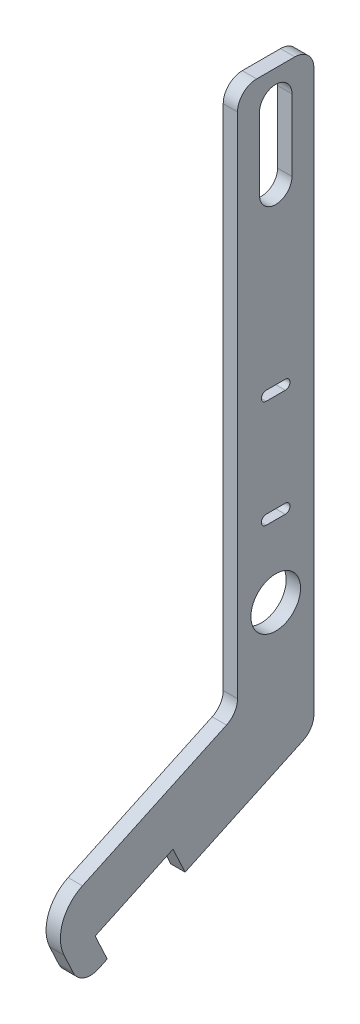
ISO-10303-21;
HEADER;
FILE_DESCRIPTION(('STEP AP214'),'2;1');
FILE_NAME('part.step','',(''),(''),'','','');
FILE_SCHEMA(('AUTOMOTIVE_DESIGN { 1 0 10303 214 1 1 1 1 }'));
ENDSEC;
DATA;
#1=APPLICATION_CONTEXT('core data for automotive mechanical design processes');
#2=APPLICATION_PROTOCOL_DEFINITION('international standard','automotive_design',2000,#1);
#3=PRODUCT_CONTEXT('',#1,'mechanical');
#4=PRODUCT('Part','Part','',(#3));
#5=PRODUCT_RELATED_PRODUCT_CATEGORY('part','',(#4));
#6=PRODUCT_DEFINITION_FORMATION('','',#4);
#7=PRODUCT_DEFINITION_CONTEXT('part definition',#1,'design');
#8=PRODUCT_DEFINITION('design','',#6,#7);
#9=PRODUCT_DEFINITION_SHAPE('','',#8);
#10=(LENGTH_UNIT() NAMED_UNIT(*) SI_UNIT(.MILLI.,.METRE.));
#11=(NAMED_UNIT(*) PLANE_ANGLE_UNIT() SI_UNIT($,.RADIAN.));
#12=(NAMED_UNIT(*) SI_UNIT($,.STERADIAN.) SOLID_ANGLE_UNIT());
#13=UNCERTAINTY_MEASURE_WITH_UNIT(LENGTH_MEASURE(1.E-05),#10,'distance_accuracy_value','');
#14=(GEOMETRIC_REPRESENTATION_CONTEXT(3) GLOBAL_UNCERTAINTY_ASSIGNED_CONTEXT((#13)) GLOBAL_UNIT_ASSIGNED_CONTEXT((#10,
#11,#12)) REPRESENTATION_CONTEXT('',''));
#15=CARTESIAN_POINT('',(0.,0.,0.));
#16=DIRECTION('',(0.,0.,1.));
#17=DIRECTION('',(1.,0.,0.));
#18=AXIS2_PLACEMENT_3D('',#15,#16,#17);
#19=CARTESIAN_POINT('',(0.,0.,0.));
#20=DIRECTION('',(1.,0.,0.));
#21=DIRECTION('',(0.,0.,-1.));
#22=AXIS2_PLACEMENT_3D('',#19,#20,#21);
#23=PLANE('',#22);
#24=CARTESIAN_POINT('',(0.,45.0488935718911,-29.8263171494505));
#25=DIRECTION('',(1.,0.,0.));
#26=DIRECTION('',(0.,0.,-1.));
#27=AXIS2_PLACEMENT_3D('',#24,#25,#26);
#28=CIRCLE('',#27,0.5);
#29=CARTESIAN_POINT('',(0.,45.5488935718911,-29.8263171494505));
#30=VERTEX_POINT('',#29);
#31=CARTESIAN_POINT('',(0.,44.5488935718911,-29.8263171494505));
#32=VERTEX_POINT('',#31);
#33=EDGE_CURVE('E62',#30,#32,#28,.T.);
#34=ORIENTED_EDGE('',*,*,#33,.F.);
#35=DIRECTION('',(0.,0.,1.));
#36=VECTOR('',#35,1.);
#37=CARTESIAN_POINT('',(0.,45.5488935718911,-29.8263171494505));
#38=LINE('',#37,#36);
#39=CARTESIAN_POINT('',(0.,45.5488935718911,-31.8263171494505));
#40=VERTEX_POINT('',#39);
#41=EDGE_CURVE('E252',#40,#30,#38,.T.);
#42=ORIENTED_EDGE('',*,*,#41,.F.);
#43=CARTESIAN_POINT('',(0.,45.0488935718911,-31.8263171494505));
#44=DIRECTION('',(1.,0.,0.));
#45=DIRECTION('',(0.,0.,-1.));
#46=AXIS2_PLACEMENT_3D('',#43,#44,#45);
#47=CIRCLE('',#46,0.5);
#48=CARTESIAN_POINT('',(0.,44.5488935718911,-31.8263171494505));
#49=VERTEX_POINT('',#48);
#50=EDGE_CURVE('E255',#49,#40,#47,.T.);
#51=ORIENTED_EDGE('',*,*,#50,.F.);
#52=DIRECTION('',(0.,0.,-1.));
#53=VECTOR('',#52,1.);
#54=CARTESIAN_POINT('',(0.,44.5488935718911,-29.8263171494505));
#55=LINE('',#54,#53);
#56=EDGE_CURVE('E261',#32,#49,#55,.T.);
#57=ORIENTED_EDGE('',*,*,#56,.F.);
#58=EDGE_LOOP('',(#34,#42,#51,#57));
#59=FACE_BOUND('',#58,.T.);
#60=CARTESIAN_POINT('',(0.,33.8,-29.8263171494505));
#61=DIRECTION('',(1.,0.,0.));
#62=DIRECTION('',(0.,0.,-1.));
#63=AXIS2_PLACEMENT_3D('',#60,#61,#62);
#64=CIRCLE('',#63,0.5);
#65=CARTESIAN_POINT('',(0.,34.3,-29.8263171494505));
#66=VERTEX_POINT('',#65);
#67=CARTESIAN_POINT('',(0.,33.3,-29.8263171494505));
#68=VERTEX_POINT('',#67);
#69=EDGE_CURVE('E70',#66,#68,#64,.T.);
#70=ORIENTED_EDGE('',*,*,#69,.F.);
#71=DIRECTION('',(0.,0.,1.));
#72=VECTOR('',#71,1.);
#73=CARTESIAN_POINT('',(0.,34.3,-29.8263171494505));
#74=LINE('',#73,#72);
#75=CARTESIAN_POINT('',(0.,34.3,-31.8263171494505));
#76=VERTEX_POINT('',#75);
#77=EDGE_CURVE('E276',#76,#66,#74,.T.);
#78=ORIENTED_EDGE('',*,*,#77,.F.);
#79=CARTESIAN_POINT('',(0.,33.8,-31.8263171494505));
#80=DIRECTION('',(1.,0.,0.));
#81=DIRECTION('',(0.,0.,-1.));
#82=AXIS2_PLACEMENT_3D('',#79,#80,#81);
#83=CIRCLE('',#82,0.5);
#84=CARTESIAN_POINT('',(0.,33.3,-31.8263171494505));
#85=VERTEX_POINT('',#84);
#86=EDGE_CURVE('E290',#85,#76,#83,.T.);
#87=ORIENTED_EDGE('',*,*,#86,.F.);
#88=DIRECTION('',(0.,0.,-1.));
#89=VECTOR('',#88,1.);
#90=CARTESIAN_POINT('',(0.,33.3,-29.8263171494505));
#91=LINE('',#90,#89);
#92=EDGE_CURVE('E287',#68,#85,#91,.T.);
#93=ORIENTED_EDGE('',*,*,#92,.F.);
#94=EDGE_LOOP('',(#70,#78,#87,#93));
#95=FACE_BOUND('',#94,.T.);
#96=DIRECTION('',(0.,1.,0.));
#97=VECTOR('',#96,1.);
#98=CARTESIAN_POINT('',(0.,21.8,-34.8263171494505));
#99=LINE('',#98,#97);
#100=CARTESIAN_POINT('',(0.,13.636226777601,-34.8263171494505));
#101=VERTEX_POINT('',#100);
#102=CARTESIAN_POINT('',(0.,72.2977871437821,-34.8263171494505));
#103=VERTEX_POINT('',#102);
#104=EDGE_CURVE('E363',#101,#103,#99,.T.);
#105=ORIENTED_EDGE('',*,*,#104,.T.);
#106=CARTESIAN_POINT('',(0.,72.2977871437821,-32.8263171494505));
#107=DIRECTION('',(1.,0.,0.));
#108=DIRECTION('',(0.,0.,-1.));
#109=AXIS2_PLACEMENT_3D('',#106,#107,#108);
#110=CIRCLE('',#109,2.);
#111=CARTESIAN_POINT('',(0.,74.2977871437821,-32.8263171494505));
#112=VERTEX_POINT('',#111);
#113=EDGE_CURVE('E311',#103,#112,#110,.T.);
#114=ORIENTED_EDGE('',*,*,#113,.T.);
#115=DIRECTION('',(0.,0.,1.));
#116=VECTOR('',#115,1.);
#117=CARTESIAN_POINT('',(0.,74.2977871437821,-34.8263171494505));
#118=LINE('',#117,#116);
#119=CARTESIAN_POINT('',(0.,74.2977871437821,-28.8263171494505));
#120=VERTEX_POINT('',#119);
#121=EDGE_CURVE('E308',#112,#120,#118,.T.);
#122=ORIENTED_EDGE('',*,*,#121,.T.);
#123=CARTESIAN_POINT('',(0.,72.2977871437821,-28.8263171494505));
#124=DIRECTION('',(1.,0.,0.));
#125=DIRECTION('',(0.,0.,-1.));
#126=AXIS2_PLACEMENT_3D('',#123,#124,#125);
#127=CIRCLE('',#126,2.);
#128=CARTESIAN_POINT('',(0.,72.2977871437821,-26.8263171494505));
#129=VERTEX_POINT('',#128);
#130=EDGE_CURVE('E305',#120,#129,#127,.T.);
#131=ORIENTED_EDGE('',*,*,#130,.T.);
#132=DIRECTION('',(0.,-1.,0.));
#133=VECTOR('',#132,1.);
#134=CARTESIAN_POINT('',(0.,63.8,-26.8263171494505));
#135=LINE('',#134,#133);
#136=CARTESIAN_POINT('',(0.,19.0638022397498,-26.8263171494505));
#137=VERTEX_POINT('',#136);
#138=EDGE_CURVE('E449',#129,#137,#135,.T.);
#139=ORIENTED_EDGE('',*,*,#138,.T.);
#140=CARTESIAN_POINT('',(0.,19.0638022397497,-24.8263171494505));
#141=DIRECTION('',(1.,0.,0.));
#142=DIRECTION('',(0.,0.,-1.));
#143=AXIS2_PLACEMENT_3D('',#140,#141,#142);
#144=CIRCLE('',#143,2.);
#145=CARTESIAN_POINT('',(0.,17.2511866656764,-25.6715536729319));
#146=VERTEX_POINT('',#145);
#147=EDGE_CURVE('E379',#137,#146,#144,.F.);
#148=ORIENTED_EDGE('',*,*,#147,.T.);
#149=DIRECTION('',(0.,-0.422618261740694,0.906307787036653));
#150=VECTOR('',#149,1.);
#151=CARTESIAN_POINT('',(0.,8.52235463240421,-6.95251296961377));
#152=LINE('',#151,#150);
#153=CARTESIAN_POINT('',(0.,10.212827679367,-10.5777441177604));
#154=VERTEX_POINT('',#153);
#155=EDGE_CURVE('E376',#146,#154,#152,.T.);
#156=ORIENTED_EDGE('',*,*,#155,.T.);
#157=CARTESIAN_POINT('',(0.,6.58759653122038,-12.2682171647232));
#158=DIRECTION('',(1.,0.,0.));
#159=DIRECTION('',(0.,0.,-1.));
#160=AXIS2_PLACEMENT_3D('',#157,#158,#159);
#161=CIRCLE('',#160,4.);
#162=CARTESIAN_POINT('',(0.,4.8971234842576,-8.64298601657654));
#163=VERTEX_POINT('',#162);
#164=EDGE_CURVE('E374',#154,#163,#161,.T.);
#165=ORIENTED_EDGE('',*,*,#164,.T.);
#166=DIRECTION('',(0.,-0.906307787036653,-0.422618261740694));
#167=VECTOR('',#166,1.);
#168=CARTESIAN_POINT('',(0.,2.35946168055498,-9.82631714945048));
#169=LINE('',#168,#167);
#170=CARTESIAN_POINT('',(0.,2.81261557407331,-9.61500801858014));
#171=VERTEX_POINT('',#170);
#172=EDGE_CURVE('E372',#163,#171,#169,.T.);
#173=ORIENTED_EDGE('',*,*,#172,.T.);
#174=CARTESIAN_POINT('',(0.,3.65785209755469,-11.4276235926534));
#175=DIRECTION('',(1.,0.,0.));
#176=DIRECTION('',(0.,0.,-1.));
#177=AXIS2_PLACEMENT_3D('',#174,#175,#176);
#178=CIRCLE('',#177,2.);
#179=CARTESIAN_POINT('',(0.,1.84523652348139,-12.2728601161348));
#180=VERTEX_POINT('',#179);
#181=EDGE_CURVE('E370',#171,#180,#178,.T.);
#182=ORIENTED_EDGE('',*,*,#181,.T.);
#183=DIRECTION('',(0.,0.422618261740694,-0.906307787036652));
#184=VECTOR('',#183,1.);
#185=CARTESIAN_POINT('',(0.,1.,-10.4602445420615));
#186=LINE('',#185,#184);
#187=CARTESIAN_POINT('',(0.,2.26785478522208,-13.1791679031715));
#188=VERTEX_POINT('',#187);
#189=EDGE_CURVE('E368',#180,#188,#186,.T.);
#190=ORIENTED_EDGE('',*,*,#189,.T.);
#191=DIRECTION('',(0.,-0.906307787036652,-0.422618261740694));
#192=VECTOR('',#191,1.);
#193=CARTESIAN_POINT('',(0.,4.98677814633204,-11.9113131179494));
#194=LINE('',#193,#192);
#195=CARTESIAN_POINT('',(0.,4.98677814633204,-11.9113131179494));
#196=VERTEX_POINT('',#195);
#197=EDGE_CURVE('E424',#196,#188,#194,.T.);
#198=ORIENTED_EDGE('',*,*,#197,.F.);
#199=DIRECTION('',(0.,-0.422618261740694,0.906307787036652));
#200=VECTOR('',#199,1.);
#201=CARTESIAN_POINT('',(0.,8.79034250199829,-20.0680832012793));
#202=LINE('',#201,#200);
#203=CARTESIAN_POINT('',(0.,8.79034250199829,-20.0680832012793));
#204=VERTEX_POINT('',#203);
#205=EDGE_CURVE('E419',#204,#196,#202,.T.);
#206=ORIENTED_EDGE('',*,*,#205,.F.);
#207=DIRECTION('',(0.,0.906307787036652,0.422618261740694));
#208=VECTOR('',#207,1.);
#209=CARTESIAN_POINT('',(0.,6.07141914088833,-21.3359379865014));
#210=LINE('',#209,#208);
#211=CARTESIAN_POINT('',(0.,6.07141914088833,-21.3359379865014));
#212=VERTEX_POINT('',#211);
#213=EDGE_CURVE('E414',#212,#204,#210,.T.);
#214=ORIENTED_EDGE('',*,*,#213,.F.);
#215=CARTESIAN_POINT('',(0.,11.8236112035277,-33.6715536729319));
#216=VERTEX_POINT('',#215);
#217=EDGE_CURVE('E367',#212,#216,#186,.T.);
#218=ORIENTED_EDGE('',*,*,#217,.T.);
#219=CARTESIAN_POINT('',(0.,13.636226777601,-32.8263171494505));
#220=DIRECTION('',(1.,0.,0.));
#221=DIRECTION('',(0.,0.,-1.));
#222=AXIS2_PLACEMENT_3D('',#219,#220,#221);
#223=CIRCLE('',#222,2.);
#224=EDGE_CURVE('E364',#216,#101,#223,.T.);
#225=ORIENTED_EDGE('',*,*,#224,.T.);
#226=EDGE_LOOP('',(#105,#114,#122,#131,#139,#148,#156,#165,#173,#182,#190,#198,#206,#214,#218,#225));
#227=FACE_BOUND('',#226,.T.);
#228=CARTESIAN_POINT('',(0.,25.8,-30.8263171494505));
#229=DIRECTION('',(1.,0.,0.));
#230=DIRECTION('',(0.,0.,-1.));
#231=AXIS2_PLACEMENT_3D('',#228,#229,#230);
#232=CIRCLE('',#231,2.6);
#233=CARTESIAN_POINT('',(0.,25.8,-33.4263171494505));
#234=VERTEX_POINT('',#233);
#235=EDGE_CURVE('E304',#234,#234,#232,.T.);
#236=ORIENTED_EDGE('',*,*,#235,.F.);
#237=EDGE_LOOP('',(#236));
#238=FACE_BOUND('',#237,.T.);
#239=CARTESIAN_POINT('',(0.,71.0977871437821,-30.8263171494505));
#240=DIRECTION('',(1.,0.,0.));
#241=DIRECTION('',(0.,0.,-1.));
#242=AXIS2_PLACEMENT_3D('',#239,#240,#241);
#243=CIRCLE('',#242,1.7);
#244=CARTESIAN_POINT('',(0.,71.0977871437821,-32.5263171494505));
#245=VERTEX_POINT('',#244);
#246=CARTESIAN_POINT('',(0.,71.0977871437821,-29.1263171494505));
#247=VERTEX_POINT('',#246);
#248=EDGE_CURVE('E340',#245,#247,#243,.T.);
#249=ORIENTED_EDGE('',*,*,#248,.F.);
#250=DIRECTION('',(0.,1.,0.));
#251=VECTOR('',#250,1.);
#252=CARTESIAN_POINT('',(0.,71.0977871437821,-32.5263171494505));
#253=LINE('',#252,#251);
#254=CARTESIAN_POINT('',(0.,63.5977871437821,-32.5263171494505));
#255=VERTEX_POINT('',#254);
#256=EDGE_CURVE('E335',#255,#245,#253,.T.);
#257=ORIENTED_EDGE('',*,*,#256,.F.);
#258=CARTESIAN_POINT('',(0.,63.5977871437821,-30.8263171494505));
#259=DIRECTION('',(1.,0.,0.));
#260=DIRECTION('',(0.,0.,-1.));
#261=AXIS2_PLACEMENT_3D('',#258,#259,#260);
#262=CIRCLE('',#261,1.7);
#263=CARTESIAN_POINT('',(0.,63.5977871437821,-29.1263171494505));
#264=VERTEX_POINT('',#263);
#265=EDGE_CURVE('E350',#264,#255,#262,.T.);
#266=ORIENTED_EDGE('',*,*,#265,.F.);
#267=DIRECTION('',(0.,-1.,0.));
#268=VECTOR('',#267,1.);
#269=CARTESIAN_POINT('',(0.,71.0977871437821,-29.1263171494505));
#270=LINE('',#269,#268);
#271=EDGE_CURVE('E345',#247,#264,#270,.T.);
#272=ORIENTED_EDGE('',*,*,#271,.F.);
#273=EDGE_LOOP('',(#249,#257,#266,#272));
#274=FACE_BOUND('',#273,.T.);
#275=ADVANCED_FACE('F47',(#59,#95,#227,#238,#274),#23,.T.);
#276=CARTESIAN_POINT('',(-1.5,21.8,-34.8263171494505));
#277=DIRECTION('',(0.,0.,-1.));
#278=DIRECTION('',(0.,1.,0.));
#279=AXIS2_PLACEMENT_3D('',#276,#277,#278);
#280=PLANE('',#279);
#281=DIRECTION('',(0.,1.,0.));
#282=VECTOR('',#281,1.);
#283=CARTESIAN_POINT('',(-1.5,12.362086255986,-34.8263171494505));
#284=LINE('',#283,#282);
#285=CARTESIAN_POINT('',(-1.5,13.636226777601,-34.8263171494505));
#286=VERTEX_POINT('',#285);
#287=CARTESIAN_POINT('',(-1.50000000000001,72.2977871437821,-34.8263171494504));
#288=VERTEX_POINT('',#287);
#289=EDGE_CURVE('E50',#286,#288,#284,.T.);
#290=ORIENTED_EDGE('',*,*,#289,.T.);
#291=DIRECTION('',(1.,0.,0.));
#292=VECTOR('',#291,1.);
#293=CARTESIAN_POINT('',(-1.50000000000001,72.2977871437821,-34.8263171494505));
#294=LINE('',#293,#292);
#295=EDGE_CURVE('E301',#288,#103,#294,.T.);
#296=ORIENTED_EDGE('',*,*,#295,.T.);
#297=ORIENTED_EDGE('',*,*,#104,.F.);
#298=DIRECTION('',(1.,0.,0.));
#299=VECTOR('',#298,1.);
#300=CARTESIAN_POINT('',(-1.5,13.636226777601,-34.8263171494505));
#301=LINE('',#300,#299);
#302=EDGE_CURVE('E381',#101,#286,#301,.F.);
#303=ORIENTED_EDGE('',*,*,#302,.T.);
#304=EDGE_LOOP('',(#290,#296,#297,#303));
#305=FACE_BOUND('',#304,.T.);
#306=ADVANCED_FACE('F462',(#305),#280,.T.);
#307=CARTESIAN_POINT('',(-1.5,63.8,-26.8263171494505));
#308=DIRECTION('',(0.,0.,1.));
#309=DIRECTION('',(0.,-1.,0.));
#310=AXIS2_PLACEMENT_3D('',#307,#308,#309);
#311=PLANE('',#310);
#312=ORIENTED_EDGE('',*,*,#138,.F.);
#313=DIRECTION('',(1.,0.,0.));
#314=VECTOR('',#313,1.);
#315=CARTESIAN_POINT('',(-1.50000000000001,72.2977871437821,-26.8263171494505));
#316=LINE('',#315,#314);
#317=CARTESIAN_POINT('',(-1.50000000000001,72.2977871437821,-26.8263171494505));
#318=VERTEX_POINT('',#317);
#319=EDGE_CURVE('E313',#129,#318,#316,.F.);
#320=ORIENTED_EDGE('',*,*,#319,.T.);
#321=DIRECTION('',(0.,-1.,0.));
#322=VECTOR('',#321,1.);
#323=CARTESIAN_POINT('',(-1.5,63.8,-26.8263171494505));
#324=LINE('',#323,#322);
#325=CARTESIAN_POINT('',(-1.5,19.0638022397498,-26.8263171494505));
#326=VERTEX_POINT('',#325);
#327=EDGE_CURVE('E12',#318,#326,#324,.T.);
#328=ORIENTED_EDGE('',*,*,#327,.T.);
#329=DIRECTION('',(1.,0.,0.));
#330=VECTOR('',#329,1.);
#331=CARTESIAN_POINT('',(0.,19.0638022397497,-26.8263171494505));
#332=LINE('',#331,#330);
#333=EDGE_CURVE('E360',#326,#137,#332,.T.);
#334=ORIENTED_EDGE('',*,*,#333,.T.);
#335=EDGE_LOOP('',(#312,#320,#328,#334));
#336=FACE_BOUND('',#335,.T.);
#337=ADVANCED_FACE('F482',(#336),#311,.T.);
#338=CARTESIAN_POINT('',(-1.5,0.,0.));
#339=DIRECTION('',(1.,0.,0.));
#340=DIRECTION('',(0.,0.,-1.));
#341=AXIS2_PLACEMENT_3D('',#338,#339,#340);
#342=PLANE('',#341);
#343=DIRECTION('',(0.,0.,1.));
#344=VECTOR('',#343,1.);
#345=CARTESIAN_POINT('',(-1.50000000000001,45.5488935718911,-29.8263171494505));
#346=LINE('',#345,#344);
#347=CARTESIAN_POINT('',(-1.50000000000001,45.5488935718911,-31.8263171494505));
#348=VERTEX_POINT('',#347);
#349=CARTESIAN_POINT('',(-1.50000000000001,45.5488935718911,-29.8263171494505));
#350=VERTEX_POINT('',#349);
#351=EDGE_CURVE('E239',#348,#350,#346,.T.);
#352=ORIENTED_EDGE('',*,*,#351,.T.);
#353=CARTESIAN_POINT('',(-1.50000000000001,45.0488935718911,-29.8263171494505));
#354=DIRECTION('',(1.,0.,0.));
#355=DIRECTION('',(0.,0.,-1.));
#356=AXIS2_PLACEMENT_3D('',#353,#354,#355);
#357=CIRCLE('',#356,0.5);
#358=CARTESIAN_POINT('',(-1.50000000000001,44.5488935718911,-29.8263171494505));
#359=VERTEX_POINT('',#358);
#360=EDGE_CURVE('E233',#350,#359,#357,.T.);
#361=ORIENTED_EDGE('',*,*,#360,.T.);
#362=DIRECTION('',(0.,0.,-1.));
#363=VECTOR('',#362,1.);
#364=CARTESIAN_POINT('',(-1.50000000000001,44.5488935718911,-29.8263171494505));
#365=LINE('',#364,#363);
#366=CARTESIAN_POINT('',(-1.5,44.5488935718911,-31.8263171494505));
#367=VERTEX_POINT('',#366);
#368=EDGE_CURVE('E243',#359,#367,#365,.T.);
#369=ORIENTED_EDGE('',*,*,#368,.T.);
#370=CARTESIAN_POINT('',(-1.50000000000001,45.0488935718911,-31.8263171494505));
#371=DIRECTION('',(1.,0.,0.));
#372=DIRECTION('',(0.,0.,-1.));
#373=AXIS2_PLACEMENT_3D('',#370,#371,#372);
#374=CIRCLE('',#373,0.5);
#375=EDGE_CURVE('E247',#367,#348,#374,.T.);
#376=ORIENTED_EDGE('',*,*,#375,.T.);
#377=EDGE_LOOP('',(#352,#361,#369,#376));
#378=FACE_BOUND('',#377,.T.);
#379=DIRECTION('',(0.,0.,1.));
#380=VECTOR('',#379,1.);
#381=CARTESIAN_POINT('',(-1.50000000000001,34.3,-29.8263171494505));
#382=LINE('',#381,#380);
#383=CARTESIAN_POINT('',(-1.50000000000001,34.3,-31.8263171494505));
#384=VERTEX_POINT('',#383);
#385=CARTESIAN_POINT('',(-1.50000000000001,34.3,-29.8263171494505));
#386=VERTEX_POINT('',#385);
#387=EDGE_CURVE('E282',#384,#386,#382,.T.);
#388=ORIENTED_EDGE('',*,*,#387,.T.);
#389=CARTESIAN_POINT('',(-1.50000000000001,33.8,-29.8263171494505));
#390=DIRECTION('',(1.,0.,0.));
#391=DIRECTION('',(0.,0.,-1.));
#392=AXIS2_PLACEMENT_3D('',#389,#390,#391);
#393=CIRCLE('',#392,0.5);
#394=CARTESIAN_POINT('',(-1.50000000000001,33.3,-29.8263171494505));
#395=VERTEX_POINT('',#394);
#396=EDGE_CURVE('E272',#386,#395,#393,.T.);
#397=ORIENTED_EDGE('',*,*,#396,.T.);
#398=DIRECTION('',(0.,0.,-1.));
#399=VECTOR('',#398,1.);
#400=CARTESIAN_POINT('',(-1.50000000000001,33.3,-29.8263171494505));
#401=LINE('',#400,#399);
#402=CARTESIAN_POINT('',(-1.5,33.3,-31.8263171494505));
#403=VERTEX_POINT('',#402);
#404=EDGE_CURVE('E275',#395,#403,#401,.T.);
#405=ORIENTED_EDGE('',*,*,#404,.T.);
#406=CARTESIAN_POINT('',(-1.50000000000001,33.8,-31.8263171494505));
#407=DIRECTION('',(1.,0.,0.));
#408=DIRECTION('',(0.,0.,-1.));
#409=AXIS2_PLACEMENT_3D('',#406,#407,#408);
#410=CIRCLE('',#409,0.5);
#411=EDGE_CURVE('E279',#403,#384,#410,.T.);
#412=ORIENTED_EDGE('',*,*,#411,.T.);
#413=EDGE_LOOP('',(#388,#397,#405,#412));
#414=FACE_BOUND('',#413,.T.);
#415=ORIENTED_EDGE('',*,*,#327,.F.);
#416=CARTESIAN_POINT('',(-1.50000000000001,72.2977871437821,-28.8263171494505));
#417=DIRECTION('',(1.,0.,0.));
#418=DIRECTION('',(0.,0.,-1.));
#419=AXIS2_PLACEMENT_3D('',#416,#417,#418);
#420=CIRCLE('',#419,2.);
#421=CARTESIAN_POINT('',(-1.50000000000001,74.2977871437821,-28.8263171494505));
#422=VERTEX_POINT('',#421);
#423=EDGE_CURVE('E319',#318,#422,#420,.F.);
#424=ORIENTED_EDGE('',*,*,#423,.T.);
#425=DIRECTION('',(0.,0.,1.));
#426=VECTOR('',#425,1.);
#427=CARTESIAN_POINT('',(-1.50000000000001,74.2977871437821,-34.8263171494505));
#428=LINE('',#427,#426);
#429=CARTESIAN_POINT('',(-1.50000000000001,74.2977871437821,-32.8263171494505));
#430=VERTEX_POINT('',#429);
#431=EDGE_CURVE('E356',#430,#422,#428,.T.);
#432=ORIENTED_EDGE('',*,*,#431,.F.);
#433=CARTESIAN_POINT('',(-1.50000000000001,72.2977871437821,-32.8263171494505));
#434=DIRECTION('',(1.,0.,0.));
#435=DIRECTION('',(0.,0.,-1.));
#436=AXIS2_PLACEMENT_3D('',#433,#434,#435);
#437=CIRCLE('',#436,2.);
#438=EDGE_CURVE('E316',#430,#288,#437,.F.);
#439=ORIENTED_EDGE('',*,*,#438,.T.);
#440=ORIENTED_EDGE('',*,*,#289,.F.);
#441=CARTESIAN_POINT('',(-1.5,13.636226777601,-32.8263171494505));
#442=DIRECTION('',(1.,0.,0.));
#443=DIRECTION('',(0.,0.,-1.));
#444=AXIS2_PLACEMENT_3D('',#441,#442,#443);
#445=CIRCLE('',#444,2.);
#446=CARTESIAN_POINT('',(-1.5,11.8236112035277,-33.6715536729319));
#447=VERTEX_POINT('',#446);
#448=EDGE_CURVE('E404',#286,#447,#445,.F.);
#449=ORIENTED_EDGE('',*,*,#448,.T.);
#450=DIRECTION('',(0.,0.422618261740694,-0.906307787036652));
#451=VECTOR('',#450,1.);
#452=CARTESIAN_POINT('',(-1.5,1.,-10.4602445420615));
#453=LINE('',#452,#451);
#454=CARTESIAN_POINT('',(-1.5,6.07141914088833,-21.3359379865014));
#455=VERTEX_POINT('',#454);
#456=EDGE_CURVE('E409',#455,#447,#453,.T.);
#457=ORIENTED_EDGE('',*,*,#456,.F.);
#458=DIRECTION('',(0.,0.906307787036652,0.422618261740694));
#459=VECTOR('',#458,1.);
#460=CARTESIAN_POINT('',(-1.5,9.25653143860095,-19.8506957299943));
#461=LINE('',#460,#459);
#462=CARTESIAN_POINT('',(-1.5,8.79034250199829,-20.0680832012793));
#463=VERTEX_POINT('',#462);
#464=EDGE_CURVE('E401',#455,#463,#461,.T.);
#465=ORIENTED_EDGE('',*,*,#464,.T.);
#466=DIRECTION('',(0.,-0.422618261740694,0.906307787036652));
#467=VECTOR('',#466,1.);
#468=CARTESIAN_POINT('',(-1.5,-0.46618893660266,-0.217387471284952));
#469=LINE('',#468,#467);
#470=CARTESIAN_POINT('',(-1.5,4.98677814633204,-11.9113131179494));
#471=VERTEX_POINT('',#470);
#472=EDGE_CURVE('E398',#463,#471,#469,.T.);
#473=ORIENTED_EDGE('',*,*,#472,.T.);
#474=DIRECTION('',(0.,-0.906307787036652,-0.422618261740694));
#475=VECTOR('',#474,1.);
#476=CARTESIAN_POINT('',(-1.5,5.4529670829347,-11.6939256466645));
#477=LINE('',#476,#475);
#478=CARTESIAN_POINT('',(-1.5,2.26785478522208,-13.1791679031715));
#479=VERTEX_POINT('',#478);
#480=EDGE_CURVE('E395',#471,#479,#477,.T.);
#481=ORIENTED_EDGE('',*,*,#480,.T.);
#482=CARTESIAN_POINT('',(-1.5,1.84523652348139,-12.2728601161348));
#483=VERTEX_POINT('',#482);
#484=EDGE_CURVE('E410',#483,#479,#453,.T.);
#485=ORIENTED_EDGE('',*,*,#484,.F.);
#486=CARTESIAN_POINT('',(-1.5,3.65785209755469,-11.4276235926534));
#487=DIRECTION('',(1.,0.,0.));
#488=DIRECTION('',(0.,0.,-1.));
#489=AXIS2_PLACEMENT_3D('',#486,#487,#488);
#490=CIRCLE('',#489,2.);
#491=CARTESIAN_POINT('',(-1.5,2.81261557407331,-9.61500801858014));
#492=VERTEX_POINT('',#491);
#493=EDGE_CURVE('E392',#483,#492,#490,.F.);
#494=ORIENTED_EDGE('',*,*,#493,.T.);
#495=DIRECTION('',(0.,-0.906307787036653,-0.422618261740694));
#496=VECTOR('',#495,1.);
#497=CARTESIAN_POINT('',(-1.5,2.35946168055498,-9.82631714945048));
#498=LINE('',#497,#496);
#499=CARTESIAN_POINT('',(-1.5,4.8971234842576,-8.64298601657654));
#500=VERTEX_POINT('',#499);
#501=EDGE_CURVE('E435',#500,#492,#498,.T.);
#502=ORIENTED_EDGE('',*,*,#501,.F.);
#503=CARTESIAN_POINT('',(-1.5,6.58759653122038,-12.2682171647232));
#504=DIRECTION('',(1.,0.,0.));
#505=DIRECTION('',(0.,0.,-1.));
#506=AXIS2_PLACEMENT_3D('',#503,#504,#505);
#507=CIRCLE('',#506,4.);
#508=CARTESIAN_POINT('',(-1.5,10.212827679367,-10.5777441177604));
#509=VERTEX_POINT('',#508);
#510=EDGE_CURVE('E390',#500,#509,#507,.F.);
#511=ORIENTED_EDGE('',*,*,#510,.T.);
#512=DIRECTION('',(0.,-0.422618261740694,0.906307787036653));
#513=VECTOR('',#512,1.);
#514=CARTESIAN_POINT('',(-1.5,8.52235463240421,-6.95251296961377));
#515=LINE('',#514,#513);
#516=CARTESIAN_POINT('',(-1.5,17.2511866656764,-25.6715536729319));
#517=VERTEX_POINT('',#516);
#518=EDGE_CURVE('E444',#517,#509,#515,.T.);
#519=ORIENTED_EDGE('',*,*,#518,.F.);
#520=CARTESIAN_POINT('',(-1.5,19.0638022397497,-24.8263171494505));
#521=DIRECTION('',(1.,0.,0.));
#522=DIRECTION('',(0.,0.,-1.));
#523=AXIS2_PLACEMENT_3D('',#520,#521,#522);
#524=CIRCLE('',#523,2.);
#525=EDGE_CURVE('E387',#517,#326,#524,.T.);
#526=ORIENTED_EDGE('',*,*,#525,.T.);
#527=EDGE_LOOP('',(#415,#424,#432,#439,#440,#449,#457,#465,#473,#481,#485,#494,#502,#511,#519,#526));
#528=FACE_BOUND('',#527,.T.);
#529=CARTESIAN_POINT('',(-1.5,25.8,-30.8263171494505));
#530=DIRECTION('',(1.,0.,0.));
#531=DIRECTION('',(0.,0.,-1.));
#532=AXIS2_PLACEMENT_3D('',#529,#530,#531);
#533=CIRCLE('',#532,2.6);
#534=CARTESIAN_POINT('',(-1.5,25.8,-33.4263171494505));
#535=VERTEX_POINT('',#534);
#536=EDGE_CURVE('E384',#535,#535,#533,.T.);
#537=ORIENTED_EDGE('',*,*,#536,.T.);
#538=EDGE_LOOP('',(#537));
#539=FACE_BOUND('',#538,.T.);
#540=DIRECTION('',(0.,1.,0.));
#541=VECTOR('',#540,1.);
#542=CARTESIAN_POINT('',(-1.5,71.0977871437821,-32.5263171494505));
#543=LINE('',#542,#541);
#544=CARTESIAN_POINT('',(-1.5,63.5977871437821,-32.5263171494505));
#545=VERTEX_POINT('',#544);
#546=CARTESIAN_POINT('',(-1.5,71.0977871437821,-32.5263171494505));
#547=VERTEX_POINT('',#546);
#548=EDGE_CURVE('E330',#545,#547,#543,.T.);
#549=ORIENTED_EDGE('',*,*,#548,.T.);
#550=CARTESIAN_POINT('',(-1.5,71.0977871437821,-30.8263171494505));
#551=DIRECTION('',(1.,0.,0.));
#552=DIRECTION('',(0.,0.,-1.));
#553=AXIS2_PLACEMENT_3D('',#550,#551,#552);
#554=CIRCLE('',#553,1.7);
#555=CARTESIAN_POINT('',(-1.5,71.0977871437821,-29.1263171494505));
#556=VERTEX_POINT('',#555);
#557=EDGE_CURVE('E327',#547,#556,#554,.T.);
#558=ORIENTED_EDGE('',*,*,#557,.T.);
#559=DIRECTION('',(0.,-1.,0.));
#560=VECTOR('',#559,1.);
#561=CARTESIAN_POINT('',(-1.5,71.0977871437821,-29.1263171494505));
#562=LINE('',#561,#560);
#563=CARTESIAN_POINT('',(-1.5,63.5977871437821,-29.1263171494505));
#564=VERTEX_POINT('',#563);
#565=EDGE_CURVE('E324',#556,#564,#562,.T.);
#566=ORIENTED_EDGE('',*,*,#565,.T.);
#567=CARTESIAN_POINT('',(-1.5,63.5977871437821,-30.8263171494505));
#568=DIRECTION('',(1.,0.,0.));
#569=DIRECTION('',(0.,0.,-1.));
#570=AXIS2_PLACEMENT_3D('',#567,#568,#569);
#571=CIRCLE('',#570,1.7);
#572=EDGE_CURVE('E321',#564,#545,#571,.T.);
#573=ORIENTED_EDGE('',*,*,#572,.T.);
#574=EDGE_LOOP('',(#549,#558,#566,#573));
#575=FACE_BOUND('',#574,.T.);
#576=ADVANCED_FACE('F249',(#378,#414,#528,#539,#575),#342,.F.);
#577=CARTESIAN_POINT('',(-1.5,25.8,-30.8263171494505));
#578=DIRECTION('',(1.,0.,0.));
#579=DIRECTION('',(0.,0.,-1.));
#580=AXIS2_PLACEMENT_3D('',#577,#578,#579);
#581=CYLINDRICAL_SURFACE('',#580,2.6);
#582=ORIENTED_EDGE('',*,*,#536,.F.);
#583=EDGE_LOOP('',(#582));
#584=FACE_BOUND('',#583,.T.);
#585=ORIENTED_EDGE('',*,*,#235,.T.);
#586=EDGE_LOOP('',(#585));
#587=FACE_BOUND('',#586,.T.);
#588=ADVANCED_FACE('F591',(#584,#587),#581,.F.);
#589=CARTESIAN_POINT('',(-1.5,19.0638022397497,-24.8263171494505));
#590=DIRECTION('',(-1.,0.,0.));
#591=DIRECTION('',(0.,0.,1.));
#592=AXIS2_PLACEMENT_3D('',#589,#590,#591);
#593=CYLINDRICAL_SURFACE('',#592,2.);
#594=ORIENTED_EDGE('',*,*,#525,.F.);
#595=DIRECTION('',(1.,0.,0.));
#596=VECTOR('',#595,1.);
#597=CARTESIAN_POINT('',(-1.5,17.2511866656764,-25.6715536729319));
#598=LINE('',#597,#596);
#599=EDGE_CURVE('E439',#146,#517,#598,.F.);
#600=ORIENTED_EDGE('',*,*,#599,.F.);
#601=ORIENTED_EDGE('',*,*,#147,.F.);
#602=ORIENTED_EDGE('',*,*,#333,.F.);
#603=EDGE_LOOP('',(#594,#600,#601,#602));
#604=FACE_BOUND('',#603,.T.);
#605=ADVANCED_FACE('F481',(#604),#593,.F.);
#606=CARTESIAN_POINT('',(-1.5,8.52235463240421,-6.95251296961377));
#607=DIRECTION('',(0.,0.906307787036653,0.422618261740693));
#608=DIRECTION('',(0.,-0.422618261740693,0.906307787036653));
#609=AXIS2_PLACEMENT_3D('',#606,#607,#608);
#610=PLANE('',#609);
#611=ORIENTED_EDGE('',*,*,#518,.T.);
#612=DIRECTION('',(1.,0.,0.));
#613=VECTOR('',#612,1.);
#614=CARTESIAN_POINT('',(-1.5,10.212827679367,-10.5777441177604));
#615=LINE('',#614,#613);
#616=EDGE_CURVE('E441',#509,#154,#615,.T.);
#617=ORIENTED_EDGE('',*,*,#616,.T.);
#618=ORIENTED_EDGE('',*,*,#155,.F.);
#619=ORIENTED_EDGE('',*,*,#599,.T.);
#620=EDGE_LOOP('',(#611,#617,#618,#619));
#621=FACE_BOUND('',#620,.T.);
#622=ADVANCED_FACE('F488',(#621),#610,.T.);
#623=CARTESIAN_POINT('',(-1.5,6.58759653122038,-12.2682171647232));
#624=DIRECTION('',(1.,0.,0.));
#625=DIRECTION('',(0.,0.,-1.));
#626=AXIS2_PLACEMENT_3D('',#623,#624,#625);
#627=CYLINDRICAL_SURFACE('',#626,4.);
#628=ORIENTED_EDGE('',*,*,#510,.F.);
#629=DIRECTION('',(1.,0.,0.));
#630=VECTOR('',#629,1.);
#631=CARTESIAN_POINT('',(-1.5,4.8971234842576,-8.64298601657654));
#632=LINE('',#631,#630);
#633=EDGE_CURVE('E437',#163,#500,#632,.F.);
#634=ORIENTED_EDGE('',*,*,#633,.F.);
#635=ORIENTED_EDGE('',*,*,#164,.F.);
#636=ORIENTED_EDGE('',*,*,#616,.F.);
#637=EDGE_LOOP('',(#628,#634,#635,#636));
#638=FACE_BOUND('',#637,.T.);
#639=ADVANCED_FACE('F490',(#638),#627,.T.);
#640=CARTESIAN_POINT('',(-1.5,2.35946168055498,-9.82631714945048));
#641=DIRECTION('',(0.,-0.422618261740694,0.906307787036653));
#642=DIRECTION('',(0.,-0.906307787036653,-0.422618261740694));
#643=AXIS2_PLACEMENT_3D('',#640,#641,#642);
#644=PLANE('',#643);
#645=ORIENTED_EDGE('',*,*,#172,.F.);
#646=ORIENTED_EDGE('',*,*,#633,.T.);
#647=ORIENTED_EDGE('',*,*,#501,.T.);
#648=DIRECTION('',(1.,0.,0.));
#649=VECTOR('',#648,1.);
#650=CARTESIAN_POINT('',(-1.5,2.81261557407331,-9.61500801858014));
#651=LINE('',#650,#649);
#652=EDGE_CURVE('E432',#492,#171,#651,.T.);
#653=ORIENTED_EDGE('',*,*,#652,.T.);
#654=EDGE_LOOP('',(#645,#646,#647,#653));
#655=FACE_BOUND('',#654,.T.);
#656=ADVANCED_FACE('F495',(#655),#644,.T.);
#657=CARTESIAN_POINT('',(-1.5,3.65785209755469,-11.4276235926534));
#658=DIRECTION('',(1.,0.,0.));
#659=DIRECTION('',(0.,0.,-1.));
#660=AXIS2_PLACEMENT_3D('',#657,#658,#659);
#661=CYLINDRICAL_SURFACE('',#660,2.);
#662=ORIENTED_EDGE('',*,*,#493,.F.);
#663=DIRECTION('',(1.,0.,0.));
#664=VECTOR('',#663,1.);
#665=CARTESIAN_POINT('',(-1.5,1.84523652348139,-12.2728601161348));
#666=LINE('',#665,#664);
#667=EDGE_CURVE('E413',#180,#483,#666,.F.);
#668=ORIENTED_EDGE('',*,*,#667,.F.);
#669=ORIENTED_EDGE('',*,*,#181,.F.);
#670=ORIENTED_EDGE('',*,*,#652,.F.);
#671=EDGE_LOOP('',(#662,#668,#669,#670));
#672=FACE_BOUND('',#671,.T.);
#673=ADVANCED_FACE('F499',(#672),#661,.T.);
#674=CARTESIAN_POINT('',(-1.5,1.,-10.4602445420615));
#675=DIRECTION('',(0.,-0.906307787036652,-0.422618261740694));
#676=DIRECTION('',(0.,0.422618261740694,-0.906307787036652));
#677=AXIS2_PLACEMENT_3D('',#674,#675,#676);
#678=PLANE('',#677);
#679=ORIENTED_EDGE('',*,*,#189,.F.);
#680=ORIENTED_EDGE('',*,*,#667,.T.);
#681=ORIENTED_EDGE('',*,*,#484,.T.);
#682=DIRECTION('',(1.,0.,0.));
#683=VECTOR('',#682,1.);
#684=CARTESIAN_POINT('',(-10.,2.26785478522208,-13.1791679031715));
#685=LINE('',#684,#683);
#686=EDGE_CURVE('E412',#479,#188,#685,.T.);
#687=ORIENTED_EDGE('',*,*,#686,.T.);
#688=EDGE_LOOP('',(#679,#680,#681,#687));
#689=FACE_BOUND('',#688,.T.);
#690=ADVANCED_FACE('F504',(#689),#678,.T.);
#691=CARTESIAN_POINT('',(-10.,4.98677814633204,-11.9113131179494));
#692=DIRECTION('',(0.,-0.422618261740694,0.906307787036652));
#693=DIRECTION('',(0.,-0.906307787036652,-0.422618261740694));
#694=AXIS2_PLACEMENT_3D('',#691,#692,#693);
#695=PLANE('',#694);
#696=DIRECTION('',(1.,0.,0.));
#697=VECTOR('',#696,1.);
#698=CARTESIAN_POINT('',(-10.,4.98677814633204,-11.9113131179494));
#699=LINE('',#698,#697);
#700=EDGE_CURVE('E427',#471,#196,#699,.T.);
#701=ORIENTED_EDGE('',*,*,#700,.T.);
#702=ORIENTED_EDGE('',*,*,#197,.T.);
#703=ORIENTED_EDGE('',*,*,#686,.F.);
#704=ORIENTED_EDGE('',*,*,#480,.F.);
#705=EDGE_LOOP('',(#701,#702,#703,#704));
#706=FACE_BOUND('',#705,.T.);
#707=ADVANCED_FACE('F508',(#706),#695,.F.);
#708=CARTESIAN_POINT('',(-10.,8.79034250199829,-20.0680832012793));
#709=DIRECTION('',(0.,0.906307787036652,0.422618261740694));
#710=DIRECTION('',(0.,-0.422618261740694,0.906307787036652));
#711=AXIS2_PLACEMENT_3D('',#708,#709,#710);
#712=PLANE('',#711);
#713=DIRECTION('',(1.,0.,0.));
#714=VECTOR('',#713,1.);
#715=CARTESIAN_POINT('',(-10.,8.79034250199829,-20.0680832012793));
#716=LINE('',#715,#714);
#717=EDGE_CURVE('E422',#463,#204,#716,.T.);
#718=ORIENTED_EDGE('',*,*,#717,.T.);
#719=ORIENTED_EDGE('',*,*,#205,.T.);
#720=ORIENTED_EDGE('',*,*,#700,.F.);
#721=ORIENTED_EDGE('',*,*,#472,.F.);
#722=EDGE_LOOP('',(#718,#719,#720,#721));
#723=FACE_BOUND('',#722,.T.);
#724=ADVANCED_FACE('F513',(#723),#712,.F.);
#725=CARTESIAN_POINT('',(-10.,6.07141914088833,-21.3359379865014));
#726=DIRECTION('',(0.,0.422618261740694,-0.906307787036652));
#727=DIRECTION('',(0.,0.906307787036652,0.422618261740694));
#728=AXIS2_PLACEMENT_3D('',#725,#726,#727);
#729=PLANE('',#728);
#730=DIRECTION('',(1.,0.,0.));
#731=VECTOR('',#730,1.);
#732=CARTESIAN_POINT('',(-10.,6.07141914088833,-21.3359379865014));
#733=LINE('',#732,#731);
#734=EDGE_CURVE('E417',#455,#212,#733,.T.);
#735=ORIENTED_EDGE('',*,*,#734,.T.);
#736=ORIENTED_EDGE('',*,*,#213,.T.);
#737=ORIENTED_EDGE('',*,*,#717,.F.);
#738=ORIENTED_EDGE('',*,*,#464,.F.);
#739=EDGE_LOOP('',(#735,#736,#737,#738));
#740=FACE_BOUND('',#739,.T.);
#741=ADVANCED_FACE('F515',(#740),#729,.F.);
#742=ORIENTED_EDGE('',*,*,#456,.T.);
#743=DIRECTION('',(1.,0.,0.));
#744=VECTOR('',#743,1.);
#745=CARTESIAN_POINT('',(-1.5,11.8236112035277,-33.6715536729319));
#746=LINE('',#745,#744);
#747=EDGE_CURVE('E406',#447,#216,#746,.T.);
#748=ORIENTED_EDGE('',*,*,#747,.T.);
#749=ORIENTED_EDGE('',*,*,#217,.F.);
#750=ORIENTED_EDGE('',*,*,#734,.F.);
#751=EDGE_LOOP('',(#742,#748,#749,#750));
#752=FACE_BOUND('',#751,.T.);
#753=ADVANCED_FACE('F522',(#752),#678,.T.);
#754=CARTESIAN_POINT('',(-1.5,13.636226777601,-32.8263171494505));
#755=DIRECTION('',(1.,0.,0.));
#756=DIRECTION('',(0.,0.,-1.));
#757=AXIS2_PLACEMENT_3D('',#754,#755,#756);
#758=CYLINDRICAL_SURFACE('',#757,2.);
#759=ORIENTED_EDGE('',*,*,#448,.F.);
#760=ORIENTED_EDGE('',*,*,#302,.F.);
#761=ORIENTED_EDGE('',*,*,#224,.F.);
#762=ORIENTED_EDGE('',*,*,#747,.F.);
#763=EDGE_LOOP('',(#759,#760,#761,#762));
#764=FACE_BOUND('',#763,.T.);
#765=ADVANCED_FACE('F525',(#764),#758,.T.);
#766=CARTESIAN_POINT('',(-1.50000000000001,72.2977871437821,-32.8263171494505));
#767=DIRECTION('',(1.,0.,0.));
#768=DIRECTION('',(0.,0.,-1.));
#769=AXIS2_PLACEMENT_3D('',#766,#767,#768);
#770=CYLINDRICAL_SURFACE('',#769,2.);
#771=ORIENTED_EDGE('',*,*,#438,.F.);
#772=DIRECTION('',(1.,0.,0.));
#773=VECTOR('',#772,1.);
#774=CARTESIAN_POINT('',(-1.50000000000001,74.2977871437821,-32.8263171494505));
#775=LINE('',#774,#773);
#776=EDGE_CURVE('E268',#112,#430,#775,.F.);
#777=ORIENTED_EDGE('',*,*,#776,.F.);
#778=ORIENTED_EDGE('',*,*,#113,.F.);
#779=ORIENTED_EDGE('',*,*,#295,.F.);
#780=EDGE_LOOP('',(#771,#777,#778,#779));
#781=FACE_BOUND('',#780,.T.);
#782=ADVANCED_FACE('F461',(#781),#770,.T.);
#783=CARTESIAN_POINT('',(-1.50000000000001,74.2977871437821,-34.8263171494505));
#784=DIRECTION('',(0.,1.,0.));
#785=DIRECTION('',(0.,0.,1.));
#786=AXIS2_PLACEMENT_3D('',#783,#784,#785);
#787=PLANE('',#786);
#788=ORIENTED_EDGE('',*,*,#121,.F.);
#789=ORIENTED_EDGE('',*,*,#776,.T.);
#790=ORIENTED_EDGE('',*,*,#431,.T.);
#791=DIRECTION('',(1.,0.,0.));
#792=VECTOR('',#791,1.);
#793=CARTESIAN_POINT('',(-1.50000000000001,74.2977871437821,-28.8263171494505));
#794=LINE('',#793,#792);
#795=EDGE_CURVE('E353',#422,#120,#794,.T.);
#796=ORIENTED_EDGE('',*,*,#795,.T.);
#797=EDGE_LOOP('',(#788,#789,#790,#796));
#798=FACE_BOUND('',#797,.T.);
#799=ADVANCED_FACE('F470',(#798),#787,.T.);
#800=CARTESIAN_POINT('',(-1.50000000000001,72.2977871437821,-28.8263171494505));
#801=DIRECTION('',(1.,0.,0.));
#802=DIRECTION('',(0.,0.,-1.));
#803=AXIS2_PLACEMENT_3D('',#800,#801,#802);
#804=CYLINDRICAL_SURFACE('',#803,2.);
#805=ORIENTED_EDGE('',*,*,#423,.F.);
#806=ORIENTED_EDGE('',*,*,#319,.F.);
#807=ORIENTED_EDGE('',*,*,#130,.F.);
#808=ORIENTED_EDGE('',*,*,#795,.F.);
#809=EDGE_LOOP('',(#805,#806,#807,#808));
#810=FACE_BOUND('',#809,.T.);
#811=ADVANCED_FACE('F472',(#810),#804,.T.);
#812=CARTESIAN_POINT('',(-1.5,63.5977871437821,-30.8263171494505));
#813=DIRECTION('',(1.,0.,0.));
#814=DIRECTION('',(0.,0.,-1.));
#815=AXIS2_PLACEMENT_3D('',#812,#813,#814);
#816=CYLINDRICAL_SURFACE('',#815,1.7);
#817=ORIENTED_EDGE('',*,*,#265,.T.);
#818=DIRECTION('',(1.,0.,0.));
#819=VECTOR('',#818,1.);
#820=CARTESIAN_POINT('',(-1.5,63.5977871437821,-32.5263171494505));
#821=LINE('',#820,#819);
#822=EDGE_CURVE('E333',#545,#255,#821,.T.);
#823=ORIENTED_EDGE('',*,*,#822,.F.);
#824=ORIENTED_EDGE('',*,*,#572,.F.);
#825=DIRECTION('',(1.,0.,0.));
#826=VECTOR('',#825,1.);
#827=CARTESIAN_POINT('',(-1.5,63.5977871437821,-29.1263171494505));
#828=LINE('',#827,#826);
#829=EDGE_CURVE('E348',#564,#264,#828,.T.);
#830=ORIENTED_EDGE('',*,*,#829,.T.);
#831=EDGE_LOOP('',(#817,#823,#824,#830));
#832=FACE_BOUND('',#831,.T.);
#833=ADVANCED_FACE('F576',(#832),#816,.F.);
#834=CARTESIAN_POINT('',(-1.5,71.0977871437821,-29.1263171494505));
#835=DIRECTION('',(0.,0.,1.));
#836=DIRECTION('',(0.,-1.,0.));
#837=AXIS2_PLACEMENT_3D('',#834,#835,#836);
#838=PLANE('',#837);
#839=ORIENTED_EDGE('',*,*,#271,.T.);
#840=ORIENTED_EDGE('',*,*,#829,.F.);
#841=ORIENTED_EDGE('',*,*,#565,.F.);
#842=DIRECTION('',(1.,0.,0.));
#843=VECTOR('',#842,1.);
#844=CARTESIAN_POINT('',(-1.5,71.0977871437821,-29.1263171494505));
#845=LINE('',#844,#843);
#846=EDGE_CURVE('E342',#556,#247,#845,.T.);
#847=ORIENTED_EDGE('',*,*,#846,.T.);
#848=EDGE_LOOP('',(#839,#840,#841,#847));
#849=FACE_BOUND('',#848,.T.);
#850=ADVANCED_FACE('F579',(#849),#838,.F.);
#851=CARTESIAN_POINT('',(-1.5,71.0977871437821,-30.8263171494505));
#852=DIRECTION('',(1.,0.,0.));
#853=DIRECTION('',(0.,0.,-1.));
#854=AXIS2_PLACEMENT_3D('',#851,#852,#853);
#855=CYLINDRICAL_SURFACE('',#854,1.7);
#856=ORIENTED_EDGE('',*,*,#248,.T.);
#857=ORIENTED_EDGE('',*,*,#846,.F.);
#858=ORIENTED_EDGE('',*,*,#557,.F.);
#859=DIRECTION('',(1.,0.,0.));
#860=VECTOR('',#859,1.);
#861=CARTESIAN_POINT('',(-1.5,71.0977871437821,-32.5263171494505));
#862=LINE('',#861,#860);
#863=EDGE_CURVE('E338',#547,#245,#862,.T.);
#864=ORIENTED_EDGE('',*,*,#863,.T.);
#865=EDGE_LOOP('',(#856,#857,#858,#864));
#866=FACE_BOUND('',#865,.T.);
#867=ADVANCED_FACE('F583',(#866),#855,.F.);
#868=CARTESIAN_POINT('',(-1.5,71.0977871437821,-32.5263171494505));
#869=DIRECTION('',(0.,0.,-1.));
#870=DIRECTION('',(0.,1.,0.));
#871=AXIS2_PLACEMENT_3D('',#868,#869,#870);
#872=PLANE('',#871);
#873=ORIENTED_EDGE('',*,*,#256,.T.);
#874=ORIENTED_EDGE('',*,*,#863,.F.);
#875=ORIENTED_EDGE('',*,*,#548,.F.);
#876=ORIENTED_EDGE('',*,*,#822,.T.);
#877=EDGE_LOOP('',(#873,#874,#875,#876));
#878=FACE_BOUND('',#877,.T.);
#879=ADVANCED_FACE('F570',(#878),#872,.F.);
#880=CARTESIAN_POINT('',(-1.50000000000001,33.8,-29.8263171494505));
#881=DIRECTION('',(1.,0.,0.));
#882=DIRECTION('',(0.,0.,-1.));
#883=AXIS2_PLACEMENT_3D('',#880,#881,#882);
#884=CYLINDRICAL_SURFACE('',#883,0.5);
#885=ORIENTED_EDGE('',*,*,#69,.T.);
#886=DIRECTION('',(1.,0.,0.));
#887=VECTOR('',#886,1.);
#888=CARTESIAN_POINT('',(-1.50000000000001,33.3,-29.8263171494505));
#889=LINE('',#888,#887);
#890=EDGE_CURVE('E285',#395,#68,#889,.T.);
#891=ORIENTED_EDGE('',*,*,#890,.F.);
#892=ORIENTED_EDGE('',*,*,#396,.F.);
#893=DIRECTION('',(1.,0.,0.));
#894=VECTOR('',#893,1.);
#895=CARTESIAN_POINT('',(-1.50000000000001,34.3,-29.8263171494505));
#896=LINE('',#895,#894);
#897=EDGE_CURVE('E262',#386,#66,#896,.T.);
#898=ORIENTED_EDGE('',*,*,#897,.T.);
#899=EDGE_LOOP('',(#885,#891,#892,#898));
#900=FACE_BOUND('',#899,.T.);
#901=ADVANCED_FACE('F553',(#900),#884,.F.);
#902=CARTESIAN_POINT('',(-1.50000000000001,34.3,-29.8263171494505));
#903=DIRECTION('',(0.,1.,0.));
#904=DIRECTION('',(0.,0.,1.));
#905=AXIS2_PLACEMENT_3D('',#902,#903,#904);
#906=PLANE('',#905);
#907=ORIENTED_EDGE('',*,*,#77,.T.);
#908=ORIENTED_EDGE('',*,*,#897,.F.);
#909=ORIENTED_EDGE('',*,*,#387,.F.);
#910=DIRECTION('',(1.,0.,0.));
#911=VECTOR('',#910,1.);
#912=CARTESIAN_POINT('',(-1.50000000000001,34.3,-31.8263171494505));
#913=LINE('',#912,#911);
#914=EDGE_CURVE('E296',#384,#76,#913,.T.);
#915=ORIENTED_EDGE('',*,*,#914,.T.);
#916=EDGE_LOOP('',(#907,#908,#909,#915));
#917=FACE_BOUND('',#916,.T.);
#918=ADVANCED_FACE('F556',(#917),#906,.F.);
#919=CARTESIAN_POINT('',(-1.50000000000001,33.8,-31.8263171494505));
#920=DIRECTION('',(1.,0.,0.));
#921=DIRECTION('',(0.,0.,-1.));
#922=AXIS2_PLACEMENT_3D('',#919,#920,#921);
#923=CYLINDRICAL_SURFACE('',#922,0.5);
#924=ORIENTED_EDGE('',*,*,#86,.T.);
#925=ORIENTED_EDGE('',*,*,#914,.F.);
#926=ORIENTED_EDGE('',*,*,#411,.F.);
#927=DIRECTION('',(1.,0.,0.));
#928=VECTOR('',#927,1.);
#929=CARTESIAN_POINT('',(-1.50000000000001,33.3,-31.8263171494505));
#930=LINE('',#929,#928);
#931=EDGE_CURVE('E298',#403,#85,#930,.T.);
#932=ORIENTED_EDGE('',*,*,#931,.T.);
#933=EDGE_LOOP('',(#924,#925,#926,#932));
#934=FACE_BOUND('',#933,.T.);
#935=ADVANCED_FACE('F558',(#934),#923,.F.);
#936=CARTESIAN_POINT('',(-1.50000000000001,33.3,-29.8263171494505));
#937=DIRECTION('',(0.,-1.,0.));
#938=DIRECTION('',(0.,0.,-1.));
#939=AXIS2_PLACEMENT_3D('',#936,#937,#938);
#940=PLANE('',#939);
#941=ORIENTED_EDGE('',*,*,#92,.T.);
#942=ORIENTED_EDGE('',*,*,#931,.F.);
#943=ORIENTED_EDGE('',*,*,#404,.F.);
#944=ORIENTED_EDGE('',*,*,#890,.T.);
#945=EDGE_LOOP('',(#941,#942,#943,#944));
#946=FACE_BOUND('',#945,.T.);
#947=ADVANCED_FACE('F550',(#946),#940,.F.);
#948=CARTESIAN_POINT('',(-1.50000000000001,45.0488935718911,-29.8263171494505));
#949=DIRECTION('',(1.,0.,0.));
#950=DIRECTION('',(0.,0.,-1.));
#951=AXIS2_PLACEMENT_3D('',#948,#949,#950);
#952=CYLINDRICAL_SURFACE('',#951,0.5);
#953=ORIENTED_EDGE('',*,*,#33,.T.);
#954=DIRECTION('',(1.,0.,0.));
#955=VECTOR('',#954,1.);
#956=CARTESIAN_POINT('',(-1.50000000000001,44.5488935718911,-29.8263171494505));
#957=LINE('',#956,#955);
#958=EDGE_CURVE('E229',#359,#32,#957,.T.);
#959=ORIENTED_EDGE('',*,*,#958,.F.);
#960=ORIENTED_EDGE('',*,*,#360,.F.);
#961=DIRECTION('',(1.,0.,0.));
#962=VECTOR('',#961,1.);
#963=CARTESIAN_POINT('',(-1.50000000000001,45.5488935718911,-29.8263171494505));
#964=LINE('',#963,#962);
#965=EDGE_CURVE('E266',#350,#30,#964,.T.);
#966=ORIENTED_EDGE('',*,*,#965,.T.);
#967=EDGE_LOOP('',(#953,#959,#960,#966));
#968=FACE_BOUND('',#967,.T.);
#969=ADVANCED_FACE('F231',(#968),#952,.F.);
#970=CARTESIAN_POINT('',(-1.50000000000001,45.5488935718911,-29.8263171494505));
#971=DIRECTION('',(0.,1.,0.));
#972=DIRECTION('',(0.,0.,1.));
#973=AXIS2_PLACEMENT_3D('',#970,#971,#972);
#974=PLANE('',#973);
#975=ORIENTED_EDGE('',*,*,#41,.T.);
#976=ORIENTED_EDGE('',*,*,#965,.F.);
#977=ORIENTED_EDGE('',*,*,#351,.F.);
#978=DIRECTION('',(1.,0.,0.));
#979=VECTOR('',#978,1.);
#980=CARTESIAN_POINT('',(-1.50000000000001,45.5488935718911,-31.8263171494505));
#981=LINE('',#980,#979);
#982=EDGE_CURVE('E269',#348,#40,#981,.T.);
#983=ORIENTED_EDGE('',*,*,#982,.T.);
#984=EDGE_LOOP('',(#975,#976,#977,#983));
#985=FACE_BOUND('',#984,.T.);
#986=ADVANCED_FACE('F708',(#985),#974,.F.);
#987=CARTESIAN_POINT('',(-1.50000000000001,45.0488935718911,-31.8263171494505));
#988=DIRECTION('',(1.,0.,0.));
#989=DIRECTION('',(0.,0.,-1.));
#990=AXIS2_PLACEMENT_3D('',#987,#988,#989);
#991=CYLINDRICAL_SURFACE('',#990,0.5);
#992=ORIENTED_EDGE('',*,*,#50,.T.);
#993=ORIENTED_EDGE('',*,*,#982,.F.);
#994=ORIENTED_EDGE('',*,*,#375,.F.);
#995=DIRECTION('',(1.,0.,0.));
#996=VECTOR('',#995,1.);
#997=CARTESIAN_POINT('',(-1.50000000000001,44.5488935718911,-31.8263171494505));
#998=LINE('',#997,#996);
#999=EDGE_CURVE('E238',#367,#49,#998,.T.);
#1000=ORIENTED_EDGE('',*,*,#999,.T.);
#1001=EDGE_LOOP('',(#992,#993,#994,#1000));
#1002=FACE_BOUND('',#1001,.T.);
#1003=ADVANCED_FACE('F716',(#1002),#991,.F.);
#1004=CARTESIAN_POINT('',(-1.50000000000001,44.5488935718911,-29.8263171494505));
#1005=DIRECTION('',(0.,-1.,0.));
#1006=DIRECTION('',(0.,0.,-1.));
#1007=AXIS2_PLACEMENT_3D('',#1004,#1005,#1006);
#1008=PLANE('',#1007);
#1009=ORIENTED_EDGE('',*,*,#56,.T.);
#1010=ORIENTED_EDGE('',*,*,#999,.F.);
#1011=ORIENTED_EDGE('',*,*,#368,.F.);
#1012=ORIENTED_EDGE('',*,*,#958,.T.);
#1013=EDGE_LOOP('',(#1009,#1010,#1011,#1012));
#1014=FACE_BOUND('',#1013,.T.);
#1015=ADVANCED_FACE('F244',(#1014),#1008,.F.);
#1016=CLOSED_SHELL('',(#275,#306,#337,#576,#588,#605,#622,#639,#656,#673,#690,#707,#724,#741,
#753,#765,#782,#799,#811,#833,#850,#867,#879,#901,#918,#935,#947,#969,#986,#1003,#1015));
#1017=MANIFOLD_SOLID_BREP('B2',#1016);
#1018=ADVANCED_BREP_SHAPE_REPRESENTATION('',(#18,#1017),#14);
#1019=SHAPE_DEFINITION_REPRESENTATION(#9,#1018);
ENDSEC;
END-ISO-10303-21;
